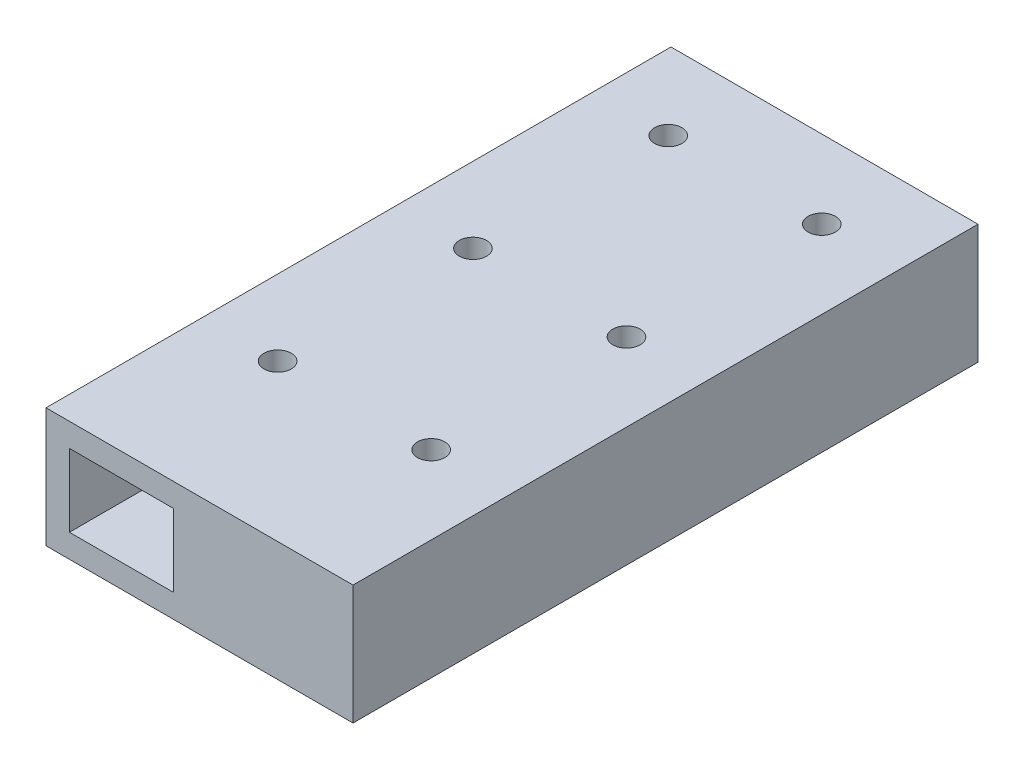
ISO-10303-21;
HEADER;
FILE_DESCRIPTION(('STEP AP214'),'2;1');
FILE_NAME('part.step','',(''),(''),'','','');
FILE_SCHEMA(('AUTOMOTIVE_DESIGN { 1 0 10303 214 1 1 1 1 }'));
ENDSEC;
DATA;
#1=APPLICATION_CONTEXT('core data for automotive mechanical design processes');
#2=APPLICATION_PROTOCOL_DEFINITION('international standard','automotive_design',2000,#1);
#3=PRODUCT_CONTEXT('',#1,'mechanical');
#4=PRODUCT('Part','Part','',(#3));
#5=PRODUCT_RELATED_PRODUCT_CATEGORY('part','',(#4));
#6=PRODUCT_DEFINITION_FORMATION('','',#4);
#7=PRODUCT_DEFINITION_CONTEXT('part definition',#1,'design');
#8=PRODUCT_DEFINITION('design','',#6,#7);
#9=PRODUCT_DEFINITION_SHAPE('','',#8);
#10=(LENGTH_UNIT() NAMED_UNIT(*) SI_UNIT(.MILLI.,.METRE.));
#11=(NAMED_UNIT(*) PLANE_ANGLE_UNIT() SI_UNIT($,.RADIAN.));
#12=(NAMED_UNIT(*) SI_UNIT($,.STERADIAN.) SOLID_ANGLE_UNIT());
#13=UNCERTAINTY_MEASURE_WITH_UNIT(LENGTH_MEASURE(1.E-05),#10,'distance_accuracy_value','');
#14=(GEOMETRIC_REPRESENTATION_CONTEXT(3) GLOBAL_UNCERTAINTY_ASSIGNED_CONTEXT((#13)) GLOBAL_UNIT_ASSIGNED_CONTEXT((#10,
#11,#12)) REPRESENTATION_CONTEXT('',''));
#15=CARTESIAN_POINT('',(0.,0.,0.));
#16=DIRECTION('',(0.,0.,1.));
#17=DIRECTION('',(1.,0.,0.));
#18=AXIS2_PLACEMENT_3D('',#15,#16,#17);
#19=CARTESIAN_POINT('',(0.,0.,80.));
#20=DIRECTION('',(0.,0.,-1.));
#21=DIRECTION('',(-1.,0.,0.));
#22=AXIS2_PLACEMENT_3D('',#19,#20,#21);
#23=PLANE('',#22);
#24=DIRECTION('',(1.,0.,0.));
#25=VECTOR('',#24,1.);
#26=CARTESIAN_POINT('',(-9.65,-7.65,80.));
#27=LINE('',#26,#25);
#28=CARTESIAN_POINT('',(-9.65,-7.65,80.));
#29=VERTEX_POINT('',#28);
#30=CARTESIAN_POINT('',(29.65,-7.65,80.));
#31=VERTEX_POINT('',#30);
#32=EDGE_CURVE('E235',#29,#31,#27,.T.);
#33=ORIENTED_EDGE('',*,*,#32,.T.);
#34=DIRECTION('',(0.,1.,0.));
#35=VECTOR('',#34,1.);
#36=CARTESIAN_POINT('',(29.65,-7.65,80.));
#37=LINE('',#36,#35);
#38=CARTESIAN_POINT('',(29.65,7.65,80.));
#39=VERTEX_POINT('',#38);
#40=EDGE_CURVE('E150',#31,#39,#37,.T.);
#41=ORIENTED_EDGE('',*,*,#40,.T.);
#42=DIRECTION('',(-1.,0.,0.));
#43=VECTOR('',#42,1.);
#44=CARTESIAN_POINT('',(-9.65,7.65,80.));
#45=LINE('',#44,#43);
#46=CARTESIAN_POINT('',(-9.65,7.65,80.));
#47=VERTEX_POINT('',#46);
#48=EDGE_CURVE('E128',#39,#47,#45,.T.);
#49=ORIENTED_EDGE('',*,*,#48,.T.);
#50=DIRECTION('',(0.,-1.,0.));
#51=VECTOR('',#50,1.);
#52=CARTESIAN_POINT('',(-9.65,-7.65,80.));
#53=LINE('',#52,#51);
#54=EDGE_CURVE('E230',#47,#29,#53,.T.);
#55=ORIENTED_EDGE('',*,*,#54,.T.);
#56=EDGE_LOOP('',(#33,#41,#49,#55));
#57=FACE_BOUND('',#56,.T.);
#58=DIRECTION('',(0.,1.,0.));
#59=VECTOR('',#58,1.);
#60=CARTESIAN_POINT('',(6.65,-4.65,80.));
#61=LINE('',#60,#59);
#62=CARTESIAN_POINT('',(6.65,-4.65,80.));
#63=VERTEX_POINT('',#62);
#64=CARTESIAN_POINT('',(6.65,4.65,80.));
#65=VERTEX_POINT('',#64);
#66=EDGE_CURVE('E187',#63,#65,#61,.T.);
#67=ORIENTED_EDGE('',*,*,#66,.F.);
#68=DIRECTION('',(1.,0.,0.));
#69=VECTOR('',#68,1.);
#70=CARTESIAN_POINT('',(-6.65,-4.65,80.));
#71=LINE('',#70,#69);
#72=CARTESIAN_POINT('',(-6.65,-4.65,80.));
#73=VERTEX_POINT('',#72);
#74=EDGE_CURVE('E199',#73,#63,#71,.T.);
#75=ORIENTED_EDGE('',*,*,#74,.F.);
#76=DIRECTION('',(0.,-1.,0.));
#77=VECTOR('',#76,1.);
#78=CARTESIAN_POINT('',(-6.65,-4.65,80.));
#79=LINE('',#78,#77);
#80=CARTESIAN_POINT('',(-6.65,4.65,80.));
#81=VERTEX_POINT('',#80);
#82=EDGE_CURVE('E197',#81,#73,#79,.T.);
#83=ORIENTED_EDGE('',*,*,#82,.F.);
#84=DIRECTION('',(-1.,0.,0.));
#85=VECTOR('',#84,1.);
#86=CARTESIAN_POINT('',(-6.65,4.65,80.));
#87=LINE('',#86,#85);
#88=EDGE_CURVE('E192',#65,#81,#87,.T.);
#89=ORIENTED_EDGE('',*,*,#88,.F.);
#90=EDGE_LOOP('',(#67,#75,#83,#89));
#91=FACE_BOUND('',#90,.T.);
#92=ADVANCED_FACE('F44',(#57,#91),#23,.F.);
#93=CARTESIAN_POINT('',(0.,0.,0.));
#94=DIRECTION('',(0.,0.,-1.));
#95=DIRECTION('',(-1.,0.,0.));
#96=AXIS2_PLACEMENT_3D('',#93,#94,#95);
#97=PLANE('',#96);
#98=DIRECTION('',(-1.,0.,0.));
#99=VECTOR('',#98,1.);
#100=CARTESIAN_POINT('',(-9.65,7.65,0.));
#101=LINE('',#100,#99);
#102=CARTESIAN_POINT('',(29.65,7.65,0.));
#103=VERTEX_POINT('',#102);
#104=CARTESIAN_POINT('',(-9.65,7.65,0.));
#105=VERTEX_POINT('',#104);
#106=EDGE_CURVE('E113',#103,#105,#101,.T.);
#107=ORIENTED_EDGE('',*,*,#106,.F.);
#108=DIRECTION('',(0.,-1.,0.));
#109=VECTOR('',#108,1.);
#110=CARTESIAN_POINT('',(29.65,-7.65,0.));
#111=LINE('',#110,#109);
#112=CARTESIAN_POINT('',(29.65,-7.65,0.));
#113=VERTEX_POINT('',#112);
#114=EDGE_CURVE('E121',#103,#113,#111,.T.);
#115=ORIENTED_EDGE('',*,*,#114,.T.);
#116=DIRECTION('',(1.,0.,0.));
#117=VECTOR('',#116,1.);
#118=CARTESIAN_POINT('',(-9.65,-7.65,0.));
#119=LINE('',#118,#117);
#120=CARTESIAN_POINT('',(-9.65,-7.65,0.));
#121=VERTEX_POINT('',#120);
#122=EDGE_CURVE('E228',#121,#113,#119,.T.);
#123=ORIENTED_EDGE('',*,*,#122,.F.);
#124=DIRECTION('',(0.,-1.,0.));
#125=VECTOR('',#124,1.);
#126=CARTESIAN_POINT('',(-9.65,-7.65,0.));
#127=LINE('',#126,#125);
#128=EDGE_CURVE('E125',#105,#121,#127,.T.);
#129=ORIENTED_EDGE('',*,*,#128,.F.);
#130=EDGE_LOOP('',(#107,#115,#123,#129));
#131=FACE_BOUND('',#130,.T.);
#132=DIRECTION('',(1.,0.,0.));
#133=VECTOR('',#132,1.);
#134=CARTESIAN_POINT('',(-6.65,-4.65,0.));
#135=LINE('',#134,#133);
#136=CARTESIAN_POINT('',(-6.65,-4.65,0.));
#137=VERTEX_POINT('',#136);
#138=CARTESIAN_POINT('',(6.65,-4.65,0.));
#139=VERTEX_POINT('',#138);
#140=EDGE_CURVE('E193',#137,#139,#135,.T.);
#141=ORIENTED_EDGE('',*,*,#140,.T.);
#142=DIRECTION('',(0.,1.,0.));
#143=VECTOR('',#142,1.);
#144=CARTESIAN_POINT('',(6.65,-4.65,0.));
#145=LINE('',#144,#143);
#146=CARTESIAN_POINT('',(6.65,4.65,0.));
#147=VERTEX_POINT('',#146);
#148=EDGE_CURVE('E72',#139,#147,#145,.T.);
#149=ORIENTED_EDGE('',*,*,#148,.T.);
#150=DIRECTION('',(-1.,0.,0.));
#151=VECTOR('',#150,1.);
#152=CARTESIAN_POINT('',(-6.65,4.65,0.));
#153=LINE('',#152,#151);
#154=CARTESIAN_POINT('',(-6.65,4.65,0.));
#155=VERTEX_POINT('',#154);
#156=EDGE_CURVE('E206',#147,#155,#153,.T.);
#157=ORIENTED_EDGE('',*,*,#156,.T.);
#158=DIRECTION('',(0.,-1.,0.));
#159=VECTOR('',#158,1.);
#160=CARTESIAN_POINT('',(-6.65,-4.65,0.));
#161=LINE('',#160,#159);
#162=EDGE_CURVE('E209',#155,#137,#161,.T.);
#163=ORIENTED_EDGE('',*,*,#162,.T.);
#164=EDGE_LOOP('',(#141,#149,#157,#163));
#165=FACE_BOUND('',#164,.T.);
#166=ADVANCED_FACE('F116',(#131,#165),#97,.T.);
#167=CARTESIAN_POINT('',(-9.65,7.65,80.));
#168=DIRECTION('',(0.,-1.,0.));
#169=DIRECTION('',(0.,0.,-1.));
#170=AXIS2_PLACEMENT_3D('',#167,#168,#169);
#171=PLANE('',#170);
#172=CARTESIAN_POINT('',(19.65,7.65,10.));
#173=DIRECTION('',(0.,1.,0.));
#174=DIRECTION('',(0.,0.,1.));
#175=AXIS2_PLACEMENT_3D('',#172,#173,#174);
#176=CIRCLE('',#175,1.75);
#177=CARTESIAN_POINT('',(19.65,7.65,11.75));
#178=VERTEX_POINT('',#177);
#179=EDGE_CURVE('E255',#178,#178,#176,.T.);
#180=ORIENTED_EDGE('',*,*,#179,.F.);
#181=EDGE_LOOP('',(#180));
#182=FACE_BOUND('',#181,.T.);
#183=CARTESIAN_POINT('',(19.65,7.65,35.));
#184=DIRECTION('',(0.,1.,0.));
#185=DIRECTION('',(0.,0.,1.));
#186=AXIS2_PLACEMENT_3D('',#183,#184,#185);
#187=CIRCLE('',#186,1.75);
#188=CARTESIAN_POINT('',(19.65,7.65,36.75));
#189=VERTEX_POINT('',#188);
#190=EDGE_CURVE('E311',#189,#189,#187,.T.);
#191=ORIENTED_EDGE('',*,*,#190,.F.);
#192=EDGE_LOOP('',(#191));
#193=FACE_BOUND('',#192,.T.);
#194=CARTESIAN_POINT('',(19.65,7.65,60.));
#195=DIRECTION('',(0.,1.,0.));
#196=DIRECTION('',(0.,0.,1.));
#197=AXIS2_PLACEMENT_3D('',#194,#195,#196);
#198=CIRCLE('',#197,1.75);
#199=CARTESIAN_POINT('',(19.65,7.65,61.75));
#200=VERTEX_POINT('',#199);
#201=EDGE_CURVE('E320',#200,#200,#198,.T.);
#202=ORIENTED_EDGE('',*,*,#201,.F.);
#203=EDGE_LOOP('',(#202));
#204=FACE_BOUND('',#203,.T.);
#205=CARTESIAN_POINT('',(0.,7.65,10.));
#206=DIRECTION('',(0.,1.,0.));
#207=DIRECTION('',(0.,0.,1.));
#208=AXIS2_PLACEMENT_3D('',#205,#206,#207);
#209=CIRCLE('',#208,1.75);
#210=CARTESIAN_POINT('',(0.,7.65,11.75));
#211=VERTEX_POINT('',#210);
#212=EDGE_CURVE('E151',#211,#211,#209,.T.);
#213=ORIENTED_EDGE('',*,*,#212,.F.);
#214=EDGE_LOOP('',(#213));
#215=FACE_BOUND('',#214,.T.);
#216=CARTESIAN_POINT('',(0.,7.65,35.));
#217=DIRECTION('',(0.,1.,0.));
#218=DIRECTION('',(0.,0.,1.));
#219=AXIS2_PLACEMENT_3D('',#216,#217,#218);
#220=CIRCLE('',#219,1.75);
#221=CARTESIAN_POINT('',(0.,7.65,36.75));
#222=VERTEX_POINT('',#221);
#223=EDGE_CURVE('E156',#222,#222,#220,.T.);
#224=ORIENTED_EDGE('',*,*,#223,.F.);
#225=EDGE_LOOP('',(#224));
#226=FACE_BOUND('',#225,.T.);
#227=CARTESIAN_POINT('',(0.,7.65,60.));
#228=DIRECTION('',(0.,1.,0.));
#229=DIRECTION('',(0.,0.,1.));
#230=AXIS2_PLACEMENT_3D('',#227,#228,#229);
#231=CIRCLE('',#230,1.75);
#232=CARTESIAN_POINT('',(0.,7.65,61.75));
#233=VERTEX_POINT('',#232);
#234=EDGE_CURVE('E159',#233,#233,#231,.T.);
#235=ORIENTED_EDGE('',*,*,#234,.F.);
#236=EDGE_LOOP('',(#235));
#237=FACE_BOUND('',#236,.T.);
#238=ORIENTED_EDGE('',*,*,#106,.T.);
#239=DIRECTION('',(0.,0.,-1.));
#240=VECTOR('',#239,1.);
#241=CARTESIAN_POINT('',(-9.65,7.65,80.));
#242=LINE('',#241,#240);
#243=EDGE_CURVE('E11',#47,#105,#242,.T.);
#244=ORIENTED_EDGE('',*,*,#243,.F.);
#245=ORIENTED_EDGE('',*,*,#48,.F.);
#246=DIRECTION('',(0.,0.,-1.));
#247=VECTOR('',#246,1.);
#248=CARTESIAN_POINT('',(29.65,7.65,105.181143738917));
#249=LINE('',#248,#247);
#250=EDGE_CURVE('E129',#39,#103,#249,.T.);
#251=ORIENTED_EDGE('',*,*,#250,.T.);
#252=EDGE_LOOP('',(#238,#244,#245,#251));
#253=FACE_BOUND('',#252,.T.);
#254=ADVANCED_FACE('F50',(#182,#193,#204,#215,#226,#237,#253),#171,.F.);
#255=CARTESIAN_POINT('',(-9.65,-7.65,80.));
#256=DIRECTION('',(1.,0.,0.));
#257=DIRECTION('',(0.,0.,-1.));
#258=AXIS2_PLACEMENT_3D('',#255,#256,#257);
#259=PLANE('',#258);
#260=ORIENTED_EDGE('',*,*,#128,.T.);
#261=DIRECTION('',(0.,0.,-1.));
#262=VECTOR('',#261,1.);
#263=CARTESIAN_POINT('',(-9.65,-7.65,80.));
#264=LINE('',#263,#262);
#265=EDGE_CURVE('E54',#29,#121,#264,.T.);
#266=ORIENTED_EDGE('',*,*,#265,.F.);
#267=ORIENTED_EDGE('',*,*,#54,.F.);
#268=ORIENTED_EDGE('',*,*,#243,.T.);
#269=EDGE_LOOP('',(#260,#266,#267,#268));
#270=FACE_BOUND('',#269,.T.);
#271=ADVANCED_FACE('F292',(#270),#259,.F.);
#272=CARTESIAN_POINT('',(-9.65,-7.65,80.));
#273=DIRECTION('',(0.,1.,0.));
#274=DIRECTION('',(0.,0.,1.));
#275=AXIS2_PLACEMENT_3D('',#272,#273,#274);
#276=PLANE('',#275);
#277=CARTESIAN_POINT('',(19.65,-7.65,10.));
#278=DIRECTION('',(0.,1.,0.));
#279=DIRECTION('',(0.,0.,1.));
#280=AXIS2_PLACEMENT_3D('',#277,#278,#279);
#281=CIRCLE('',#280,1.75);
#282=CARTESIAN_POINT('',(19.65,-7.65,11.75));
#283=VERTEX_POINT('',#282);
#284=EDGE_CURVE('E47',#283,#283,#281,.T.);
#285=ORIENTED_EDGE('',*,*,#284,.T.);
#286=EDGE_LOOP('',(#285));
#287=FACE_BOUND('',#286,.T.);
#288=CARTESIAN_POINT('',(19.65,-7.65,35.));
#289=DIRECTION('',(0.,1.,0.));
#290=DIRECTION('',(0.,0.,1.));
#291=AXIS2_PLACEMENT_3D('',#288,#289,#290);
#292=CIRCLE('',#291,1.75);
#293=CARTESIAN_POINT('',(19.65,-7.65,36.75));
#294=VERTEX_POINT('',#293);
#295=EDGE_CURVE('E145',#294,#294,#292,.T.);
#296=ORIENTED_EDGE('',*,*,#295,.T.);
#297=EDGE_LOOP('',(#296));
#298=FACE_BOUND('',#297,.T.);
#299=CARTESIAN_POINT('',(19.65,-7.65,60.));
#300=DIRECTION('',(0.,1.,0.));
#301=DIRECTION('',(0.,0.,1.));
#302=AXIS2_PLACEMENT_3D('',#299,#300,#301);
#303=CIRCLE('',#302,1.75);
#304=CARTESIAN_POINT('',(19.65,-7.65,61.75));
#305=VERTEX_POINT('',#304);
#306=EDGE_CURVE('E253',#305,#305,#303,.T.);
#307=ORIENTED_EDGE('',*,*,#306,.T.);
#308=EDGE_LOOP('',(#307));
#309=FACE_BOUND('',#308,.T.);
#310=CARTESIAN_POINT('',(0.,-7.65,10.));
#311=DIRECTION('',(0.,1.,0.));
#312=DIRECTION('',(0.,0.,1.));
#313=AXIS2_PLACEMENT_3D('',#310,#311,#312);
#314=CIRCLE('',#313,1.75);
#315=CARTESIAN_POINT('',(0.,-7.65,11.75));
#316=VERTEX_POINT('',#315);
#317=EDGE_CURVE('E189',#316,#316,#314,.T.);
#318=ORIENTED_EDGE('',*,*,#317,.T.);
#319=EDGE_LOOP('',(#318));
#320=FACE_BOUND('',#319,.T.);
#321=CARTESIAN_POINT('',(0.,-7.65,35.));
#322=DIRECTION('',(0.,1.,0.));
#323=DIRECTION('',(0.,0.,1.));
#324=AXIS2_PLACEMENT_3D('',#321,#322,#323);
#325=CIRCLE('',#324,1.75);
#326=CARTESIAN_POINT('',(0.,-7.65,36.75));
#327=VERTEX_POINT('',#326);
#328=EDGE_CURVE('E180',#327,#327,#325,.T.);
#329=ORIENTED_EDGE('',*,*,#328,.T.);
#330=EDGE_LOOP('',(#329));
#331=FACE_BOUND('',#330,.T.);
#332=CARTESIAN_POINT('',(0.,-7.65,60.));
#333=DIRECTION('',(0.,1.,0.));
#334=DIRECTION('',(0.,0.,1.));
#335=AXIS2_PLACEMENT_3D('',#332,#333,#334);
#336=CIRCLE('',#335,1.75);
#337=CARTESIAN_POINT('',(0.,-7.65,61.75));
#338=VERTEX_POINT('',#337);
#339=EDGE_CURVE('E169',#338,#338,#336,.T.);
#340=ORIENTED_EDGE('',*,*,#339,.T.);
#341=EDGE_LOOP('',(#340));
#342=FACE_BOUND('',#341,.T.);
#343=ORIENTED_EDGE('',*,*,#122,.T.);
#344=DIRECTION('',(0.,0.,-1.));
#345=VECTOR('',#344,1.);
#346=CARTESIAN_POINT('',(29.65,-7.65,105.181143738917));
#347=LINE('',#346,#345);
#348=EDGE_CURVE('E132',#31,#113,#347,.T.);
#349=ORIENTED_EDGE('',*,*,#348,.F.);
#350=ORIENTED_EDGE('',*,*,#32,.F.);
#351=ORIENTED_EDGE('',*,*,#265,.T.);
#352=EDGE_LOOP('',(#343,#349,#350,#351));
#353=FACE_BOUND('',#352,.T.);
#354=ADVANCED_FACE('F259',(#287,#298,#309,#320,#331,#342,#353),#276,.F.);
#355=CARTESIAN_POINT('',(6.65,-4.65,80.));
#356=DIRECTION('',(-1.,0.,0.));
#357=DIRECTION('',(0.,0.,1.));
#358=AXIS2_PLACEMENT_3D('',#355,#356,#357);
#359=PLANE('',#358);
#360=ORIENTED_EDGE('',*,*,#148,.F.);
#361=DIRECTION('',(0.,0.,-1.));
#362=VECTOR('',#361,1.);
#363=CARTESIAN_POINT('',(6.65,-4.65,80.));
#364=LINE('',#363,#362);
#365=EDGE_CURVE('E201',#63,#139,#364,.T.);
#366=ORIENTED_EDGE('',*,*,#365,.F.);
#367=ORIENTED_EDGE('',*,*,#66,.T.);
#368=DIRECTION('',(0.,0.,-1.));
#369=VECTOR('',#368,1.);
#370=CARTESIAN_POINT('',(6.65,4.65,80.));
#371=LINE('',#370,#369);
#372=EDGE_CURVE('E127',#65,#147,#371,.T.);
#373=ORIENTED_EDGE('',*,*,#372,.T.);
#374=EDGE_LOOP('',(#360,#366,#367,#373));
#375=FACE_BOUND('',#374,.T.);
#376=ADVANCED_FACE('F290',(#375),#359,.T.);
#377=CARTESIAN_POINT('',(-6.65,4.65,80.));
#378=DIRECTION('',(0.,-1.,0.));
#379=DIRECTION('',(0.,0.,-1.));
#380=AXIS2_PLACEMENT_3D('',#377,#378,#379);
#381=PLANE('',#380);
#382=CARTESIAN_POINT('',(0.,4.65,10.));
#383=DIRECTION('',(0.,-1.,0.));
#384=DIRECTION('',(0.,0.,-1.));
#385=AXIS2_PLACEMENT_3D('',#382,#383,#384);
#386=CIRCLE('',#385,1.75);
#387=CARTESIAN_POINT('',(0.,4.65,8.25));
#388=VERTEX_POINT('',#387);
#389=EDGE_CURVE('E185',#388,#388,#386,.T.);
#390=ORIENTED_EDGE('',*,*,#389,.F.);
#391=EDGE_LOOP('',(#390));
#392=FACE_BOUND('',#391,.T.);
#393=CARTESIAN_POINT('',(0.,4.65,35.));
#394=DIRECTION('',(0.,-1.,0.));
#395=DIRECTION('',(0.,0.,-1.));
#396=AXIS2_PLACEMENT_3D('',#393,#394,#395);
#397=CIRCLE('',#396,1.75);
#398=CARTESIAN_POINT('',(0.,4.65,33.25));
#399=VERTEX_POINT('',#398);
#400=EDGE_CURVE('E175',#399,#399,#397,.T.);
#401=ORIENTED_EDGE('',*,*,#400,.F.);
#402=EDGE_LOOP('',(#401));
#403=FACE_BOUND('',#402,.T.);
#404=CARTESIAN_POINT('',(0.,4.65,60.));
#405=DIRECTION('',(0.,-1.,0.));
#406=DIRECTION('',(0.,0.,-1.));
#407=AXIS2_PLACEMENT_3D('',#404,#405,#406);
#408=CIRCLE('',#407,1.75);
#409=CARTESIAN_POINT('',(0.,4.65,58.25));
#410=VERTEX_POINT('',#409);
#411=EDGE_CURVE('E163',#410,#410,#408,.T.);
#412=ORIENTED_EDGE('',*,*,#411,.F.);
#413=EDGE_LOOP('',(#412));
#414=FACE_BOUND('',#413,.T.);
#415=ORIENTED_EDGE('',*,*,#156,.F.);
#416=ORIENTED_EDGE('',*,*,#372,.F.);
#417=ORIENTED_EDGE('',*,*,#88,.T.);
#418=DIRECTION('',(0.,0.,-1.));
#419=VECTOR('',#418,1.);
#420=CARTESIAN_POINT('',(-6.65,4.65,80.));
#421=LINE('',#420,#419);
#422=EDGE_CURVE('E222',#81,#155,#421,.T.);
#423=ORIENTED_EDGE('',*,*,#422,.T.);
#424=EDGE_LOOP('',(#415,#416,#417,#423));
#425=FACE_BOUND('',#424,.T.);
#426=ADVANCED_FACE('F368',(#392,#403,#414,#425),#381,.T.);
#427=CARTESIAN_POINT('',(-6.65,-4.65,80.));
#428=DIRECTION('',(1.,0.,0.));
#429=DIRECTION('',(0.,0.,-1.));
#430=AXIS2_PLACEMENT_3D('',#427,#428,#429);
#431=PLANE('',#430);
#432=ORIENTED_EDGE('',*,*,#162,.F.);
#433=ORIENTED_EDGE('',*,*,#422,.F.);
#434=ORIENTED_EDGE('',*,*,#82,.T.);
#435=DIRECTION('',(0.,0.,-1.));
#436=VECTOR('',#435,1.);
#437=CARTESIAN_POINT('',(-6.65,-4.65,80.));
#438=LINE('',#437,#436);
#439=EDGE_CURVE('E65',#73,#137,#438,.T.);
#440=ORIENTED_EDGE('',*,*,#439,.T.);
#441=EDGE_LOOP('',(#432,#433,#434,#440));
#442=FACE_BOUND('',#441,.T.);
#443=ADVANCED_FACE('F348',(#442),#431,.T.);
#444=CARTESIAN_POINT('',(-6.65,-4.65,80.));
#445=DIRECTION('',(0.,1.,0.));
#446=DIRECTION('',(0.,0.,1.));
#447=AXIS2_PLACEMENT_3D('',#444,#445,#446);
#448=PLANE('',#447);
#449=CARTESIAN_POINT('',(0.,-4.65,10.));
#450=DIRECTION('',(0.,1.,0.));
#451=DIRECTION('',(0.,0.,1.));
#452=AXIS2_PLACEMENT_3D('',#449,#450,#451);
#453=CIRCLE('',#452,1.75);
#454=CARTESIAN_POINT('',(0.,-4.65,11.75));
#455=VERTEX_POINT('',#454);
#456=EDGE_CURVE('E182',#455,#455,#453,.T.);
#457=ORIENTED_EDGE('',*,*,#456,.F.);
#458=EDGE_LOOP('',(#457));
#459=FACE_BOUND('',#458,.T.);
#460=CARTESIAN_POINT('',(0.,-4.65,35.));
#461=DIRECTION('',(0.,1.,0.));
#462=DIRECTION('',(0.,0.,1.));
#463=AXIS2_PLACEMENT_3D('',#460,#461,#462);
#464=CIRCLE('',#463,1.75);
#465=CARTESIAN_POINT('',(0.,-4.65,36.75));
#466=VERTEX_POINT('',#465);
#467=EDGE_CURVE('E171',#466,#466,#464,.T.);
#468=ORIENTED_EDGE('',*,*,#467,.F.);
#469=EDGE_LOOP('',(#468));
#470=FACE_BOUND('',#469,.T.);
#471=CARTESIAN_POINT('',(0.,-4.65,60.));
#472=DIRECTION('',(0.,1.,0.));
#473=DIRECTION('',(0.,0.,1.));
#474=AXIS2_PLACEMENT_3D('',#471,#472,#473);
#475=CIRCLE('',#474,1.75);
#476=CARTESIAN_POINT('',(0.,-4.65,61.75));
#477=VERTEX_POINT('',#476);
#478=EDGE_CURVE('E154',#477,#477,#475,.T.);
#479=ORIENTED_EDGE('',*,*,#478,.F.);
#480=EDGE_LOOP('',(#479));
#481=FACE_BOUND('',#480,.T.);
#482=ORIENTED_EDGE('',*,*,#140,.F.);
#483=ORIENTED_EDGE('',*,*,#439,.F.);
#484=ORIENTED_EDGE('',*,*,#74,.T.);
#485=ORIENTED_EDGE('',*,*,#365,.T.);
#486=EDGE_LOOP('',(#482,#483,#484,#485));
#487=FACE_BOUND('',#486,.T.);
#488=ADVANCED_FACE('F342',(#459,#470,#481,#487),#448,.T.);
#489=CARTESIAN_POINT('',(0.,-92.35,60.));
#490=DIRECTION('',(0.,1.,0.));
#491=DIRECTION('',(0.,0.,1.));
#492=AXIS2_PLACEMENT_3D('',#489,#490,#491);
#493=CYLINDRICAL_SURFACE('',#492,1.75);
#494=ORIENTED_EDGE('',*,*,#478,.T.);
#495=EDGE_LOOP('',(#494));
#496=FACE_BOUND('',#495,.T.);
#497=ORIENTED_EDGE('',*,*,#339,.F.);
#498=EDGE_LOOP('',(#497));
#499=FACE_BOUND('',#498,.T.);
#500=ADVANCED_FACE('F329',(#496,#499),#493,.F.);
#501=CARTESIAN_POINT('',(0.,-92.35,35.));
#502=DIRECTION('',(0.,1.,0.));
#503=DIRECTION('',(0.,0.,1.));
#504=AXIS2_PLACEMENT_3D('',#501,#502,#503);
#505=CYLINDRICAL_SURFACE('',#504,1.75);
#506=ORIENTED_EDGE('',*,*,#467,.T.);
#507=EDGE_LOOP('',(#506));
#508=FACE_BOUND('',#507,.T.);
#509=ORIENTED_EDGE('',*,*,#328,.F.);
#510=EDGE_LOOP('',(#509));
#511=FACE_BOUND('',#510,.T.);
#512=ADVANCED_FACE('F340',(#508,#511),#505,.F.);
#513=CARTESIAN_POINT('',(0.,-92.35,10.));
#514=DIRECTION('',(0.,1.,0.));
#515=DIRECTION('',(0.,0.,1.));
#516=AXIS2_PLACEMENT_3D('',#513,#514,#515);
#517=CYLINDRICAL_SURFACE('',#516,1.75);
#518=ORIENTED_EDGE('',*,*,#456,.T.);
#519=EDGE_LOOP('',(#518));
#520=FACE_BOUND('',#519,.T.);
#521=ORIENTED_EDGE('',*,*,#317,.F.);
#522=EDGE_LOOP('',(#521));
#523=FACE_BOUND('',#522,.T.);
#524=ADVANCED_FACE('F330',(#520,#523),#517,.F.);
#525=ORIENTED_EDGE('',*,*,#411,.T.);
#526=EDGE_LOOP('',(#525));
#527=FACE_BOUND('',#526,.T.);
#528=ORIENTED_EDGE('',*,*,#234,.T.);
#529=EDGE_LOOP('',(#528));
#530=FACE_BOUND('',#529,.T.);
#531=ADVANCED_FACE('F322',(#527,#530),#493,.F.);
#532=ORIENTED_EDGE('',*,*,#400,.T.);
#533=EDGE_LOOP('',(#532));
#534=FACE_BOUND('',#533,.T.);
#535=ORIENTED_EDGE('',*,*,#223,.T.);
#536=EDGE_LOOP('',(#535));
#537=FACE_BOUND('',#536,.T.);
#538=ADVANCED_FACE('F326',(#534,#537),#505,.F.);
#539=ORIENTED_EDGE('',*,*,#389,.T.);
#540=EDGE_LOOP('',(#539));
#541=FACE_BOUND('',#540,.T.);
#542=ORIENTED_EDGE('',*,*,#212,.T.);
#543=EDGE_LOOP('',(#542));
#544=FACE_BOUND('',#543,.T.);
#545=ADVANCED_FACE('F333',(#541,#544),#517,.F.);
#546=CARTESIAN_POINT('',(29.65,-7.65,105.181143738917));
#547=DIRECTION('',(1.,0.,0.));
#548=DIRECTION('',(0.,0.,-1.));
#549=AXIS2_PLACEMENT_3D('',#546,#547,#548);
#550=PLANE('',#549);
#551=ORIENTED_EDGE('',*,*,#40,.F.);
#552=ORIENTED_EDGE('',*,*,#348,.T.);
#553=ORIENTED_EDGE('',*,*,#114,.F.);
#554=ORIENTED_EDGE('',*,*,#250,.F.);
#555=EDGE_LOOP('',(#551,#552,#553,#554));
#556=FACE_BOUND('',#555,.T.);
#557=ADVANCED_FACE('F137',(#556),#550,.T.);
#558=CARTESIAN_POINT('',(19.65,-92.35,60.));
#559=DIRECTION('',(0.,1.,0.));
#560=DIRECTION('',(0.,0.,1.));
#561=AXIS2_PLACEMENT_3D('',#558,#559,#560);
#562=CYLINDRICAL_SURFACE('',#561,1.75);
#563=ORIENTED_EDGE('',*,*,#201,.T.);
#564=EDGE_LOOP('',(#563));
#565=FACE_BOUND('',#564,.T.);
#566=ORIENTED_EDGE('',*,*,#306,.F.);
#567=EDGE_LOOP('',(#566));
#568=FACE_BOUND('',#567,.T.);
#569=ADVANCED_FACE('F264',(#565,#568),#562,.F.);
#570=CARTESIAN_POINT('',(19.65,-92.35,35.));
#571=DIRECTION('',(0.,1.,0.));
#572=DIRECTION('',(0.,0.,1.));
#573=AXIS2_PLACEMENT_3D('',#570,#571,#572);
#574=CYLINDRICAL_SURFACE('',#573,1.75);
#575=ORIENTED_EDGE('',*,*,#190,.T.);
#576=EDGE_LOOP('',(#575));
#577=FACE_BOUND('',#576,.T.);
#578=ORIENTED_EDGE('',*,*,#295,.F.);
#579=EDGE_LOOP('',(#578));
#580=FACE_BOUND('',#579,.T.);
#581=ADVANCED_FACE('F265',(#577,#580),#574,.F.);
#582=CARTESIAN_POINT('',(19.65,-92.35,10.));
#583=DIRECTION('',(0.,1.,0.));
#584=DIRECTION('',(0.,0.,1.));
#585=AXIS2_PLACEMENT_3D('',#582,#583,#584);
#586=CYLINDRICAL_SURFACE('',#585,1.75);
#587=ORIENTED_EDGE('',*,*,#179,.T.);
#588=EDGE_LOOP('',(#587));
#589=FACE_BOUND('',#588,.T.);
#590=ORIENTED_EDGE('',*,*,#284,.F.);
#591=EDGE_LOOP('',(#590));
#592=FACE_BOUND('',#591,.T.);
#593=ADVANCED_FACE('F262',(#589,#592),#586,.F.);
#594=CLOSED_SHELL('',(#92,#166,#254,#271,#354,#376,#426,#443,#488,#500,#512,#524,#531,#538,#545,
#557,#569,#581,#593));
#595=MANIFOLD_SOLID_BREP('B2',#594);
#596=ADVANCED_BREP_SHAPE_REPRESENTATION('',(#18,#595),#14);
#597=SHAPE_DEFINITION_REPRESENTATION(#9,#596);
ENDSEC;
END-ISO-10303-21;
